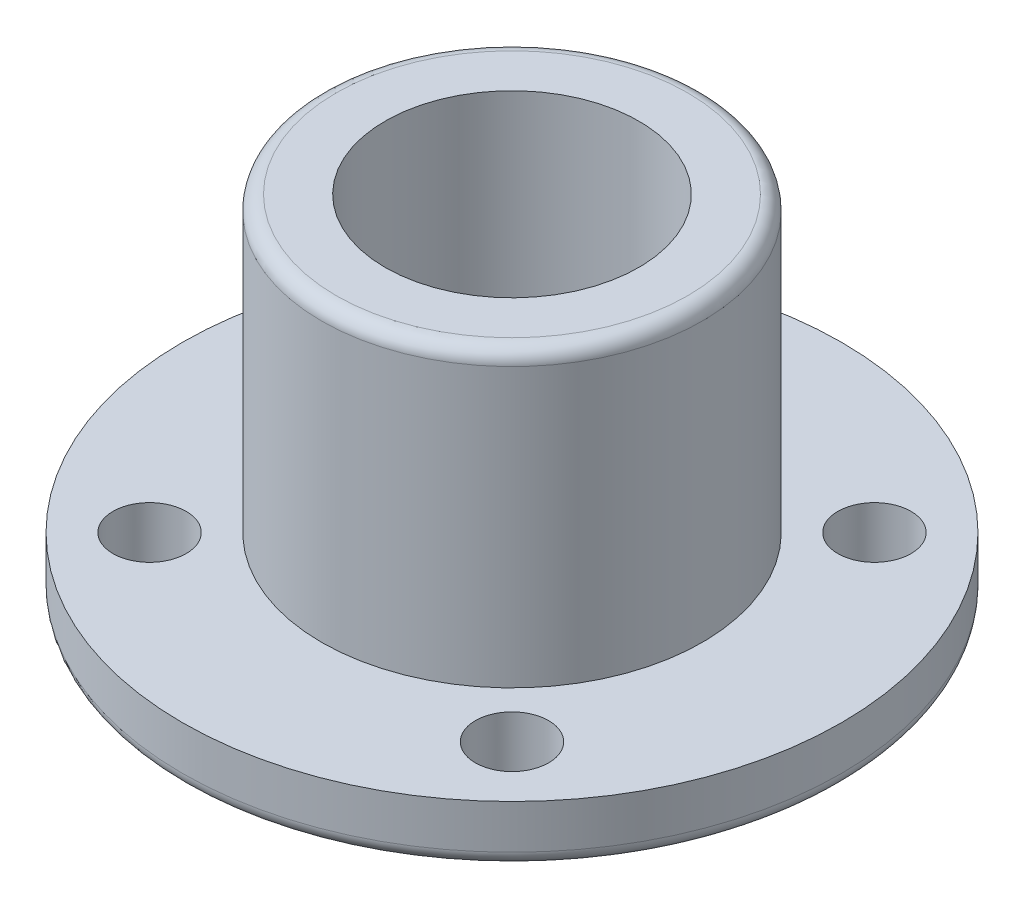
ISO-10303-21;
HEADER;
FILE_DESCRIPTION(('STEP AP214'),'2;1');
FILE_NAME('part.step','',(''),(''),'','','');
FILE_SCHEMA(('AUTOMOTIVE_DESIGN { 1 0 10303 214 1 1 1 1 }'));
ENDSEC;
DATA;
#1=APPLICATION_CONTEXT('core data for automotive mechanical design processes');
#2=APPLICATION_PROTOCOL_DEFINITION('international standard','automotive_design',2000,#1);
#3=PRODUCT_CONTEXT('',#1,'mechanical');
#4=PRODUCT('Part','Part','',(#3));
#5=PRODUCT_RELATED_PRODUCT_CATEGORY('part','',(#4));
#6=PRODUCT_DEFINITION_FORMATION('','',#4);
#7=PRODUCT_DEFINITION_CONTEXT('part definition',#1,'design');
#8=PRODUCT_DEFINITION('design','',#6,#7);
#9=PRODUCT_DEFINITION_SHAPE('','',#8);
#10=(LENGTH_UNIT() NAMED_UNIT(*) SI_UNIT(.MILLI.,.METRE.));
#11=(NAMED_UNIT(*) PLANE_ANGLE_UNIT() SI_UNIT($,.RADIAN.));
#12=(NAMED_UNIT(*) SI_UNIT($,.STERADIAN.) SOLID_ANGLE_UNIT());
#13=UNCERTAINTY_MEASURE_WITH_UNIT(LENGTH_MEASURE(1.E-05),#10,'distance_accuracy_value','');
#14=(GEOMETRIC_REPRESENTATION_CONTEXT(3) GLOBAL_UNCERTAINTY_ASSIGNED_CONTEXT((#13)) GLOBAL_UNIT_ASSIGNED_CONTEXT((#10,
#11,#12)) REPRESENTATION_CONTEXT('',''));
#15=CARTESIAN_POINT('',(0.,0.,0.));
#16=DIRECTION('',(0.,0.,1.));
#17=DIRECTION('',(1.,0.,0.));
#18=AXIS2_PLACEMENT_3D('',#15,#16,#17);
#19=CARTESIAN_POINT('',(0.,5.08,0.));
#20=DIRECTION('',(0.,-1.,0.));
#21=DIRECTION('',(0.,0.,-1.));
#22=AXIS2_PLACEMENT_3D('',#19,#20,#21);
#23=CYLINDRICAL_SURFACE('',#22,28.575);
#24=CARTESIAN_POINT('',(0.,1.27,0.));
#25=DIRECTION('',(0.,1.,0.));
#26=DIRECTION('',(0.,0.,1.));
#27=AXIS2_PLACEMENT_3D('',#24,#25,#26);
#28=CIRCLE('',#27,28.575);
#29=CARTESIAN_POINT('',(0.,1.27,28.575));
#30=VERTEX_POINT('',#29);
#31=EDGE_CURVE('E39',#30,#30,#28,.T.);
#32=ORIENTED_EDGE('',*,*,#31,.T.);
#33=EDGE_LOOP('',(#32));
#34=FACE_BOUND('',#33,.T.);
#35=CARTESIAN_POINT('',(0.,5.08,0.));
#36=DIRECTION('',(0.,1.,0.));
#37=DIRECTION('',(0.,0.,1.));
#38=AXIS2_PLACEMENT_3D('',#35,#36,#37);
#39=CIRCLE('',#38,28.575);
#40=CARTESIAN_POINT('',(0.,5.08,28.575));
#41=VERTEX_POINT('',#40);
#42=EDGE_CURVE('E70',#41,#41,#39,.T.);
#43=ORIENTED_EDGE('',*,*,#42,.F.);
#44=EDGE_LOOP('',(#43));
#45=FACE_BOUND('',#44,.T.);
#46=ADVANCED_FACE('F32',(#34,#45),#23,.T.);
#47=CARTESIAN_POINT('',(0.,5.08,0.));
#48=DIRECTION('',(0.,1.,0.));
#49=DIRECTION('',(0.,0.,1.));
#50=AXIS2_PLACEMENT_3D('',#47,#48,#49);
#51=PLANE('',#50);
#52=CARTESIAN_POINT('',(-15.7154482118708,5.08,-15.7154482118712));
#53=DIRECTION('',(0.,1.,0.));
#54=DIRECTION('',(0.,0.,1.));
#55=AXIS2_PLACEMENT_3D('',#52,#53,#54);
#56=CIRCLE('',#55,3.175);
#57=CARTESIAN_POINT('',(-15.7154482118708,5.08,-12.5404482118712));
#58=VERTEX_POINT('',#57);
#59=EDGE_CURVE('E58',#58,#58,#56,.T.);
#60=ORIENTED_EDGE('',*,*,#59,.F.);
#61=EDGE_LOOP('',(#60));
#62=FACE_BOUND('',#61,.T.);
#63=CARTESIAN_POINT('',(15.715448211871,5.08,-15.715448211871));
#64=DIRECTION('',(0.,1.,0.));
#65=DIRECTION('',(0.,0.,1.));
#66=AXIS2_PLACEMENT_3D('',#63,#64,#65);
#67=CIRCLE('',#66,3.175);
#68=CARTESIAN_POINT('',(15.715448211871,5.08,-12.540448211871));
#69=VERTEX_POINT('',#68);
#70=EDGE_CURVE('E62',#69,#69,#67,.T.);
#71=ORIENTED_EDGE('',*,*,#70,.F.);
#72=EDGE_LOOP('',(#71));
#73=FACE_BOUND('',#72,.T.);
#74=CARTESIAN_POINT('',(15.7154482118709,5.08,15.7154482118711));
#75=DIRECTION('',(0.,1.,0.));
#76=DIRECTION('',(0.,0.,1.));
#77=AXIS2_PLACEMENT_3D('',#74,#75,#76);
#78=CIRCLE('',#77,3.175);
#79=CARTESIAN_POINT('',(15.7154482118709,5.08,18.8904482118711));
#80=VERTEX_POINT('',#79);
#81=EDGE_CURVE('E66',#80,#80,#78,.T.);
#82=ORIENTED_EDGE('',*,*,#81,.F.);
#83=EDGE_LOOP('',(#82));
#84=FACE_BOUND('',#83,.T.);
#85=CARTESIAN_POINT('',(-15.7154482118712,5.08,15.7154482118709));
#86=DIRECTION('',(0.,1.,0.));
#87=DIRECTION('',(0.,0.,1.));
#88=AXIS2_PLACEMENT_3D('',#85,#86,#87);
#89=CIRCLE('',#88,3.175);
#90=CARTESIAN_POINT('',(-15.7154482118712,5.08,18.8904482118709));
#91=VERTEX_POINT('',#90);
#92=EDGE_CURVE('E73',#91,#91,#89,.T.);
#93=ORIENTED_EDGE('',*,*,#92,.F.);
#94=EDGE_LOOP('',(#93));
#95=FACE_BOUND('',#94,.T.);
#96=CARTESIAN_POINT('',(0.,5.08,0.));
#97=DIRECTION('',(0.,1.,0.));
#98=DIRECTION('',(0.,0.,1.));
#99=AXIS2_PLACEMENT_3D('',#96,#97,#98);
#100=CIRCLE('',#99,16.51);
#101=CARTESIAN_POINT('',(0.,5.08,16.51));
#102=VERTEX_POINT('',#101);
#103=EDGE_CURVE('E52',#102,#102,#100,.T.);
#104=ORIENTED_EDGE('',*,*,#103,.F.);
#105=EDGE_LOOP('',(#104));
#106=FACE_BOUND('',#105,.T.);
#107=ORIENTED_EDGE('',*,*,#42,.T.);
#108=EDGE_LOOP('',(#107));
#109=FACE_BOUND('',#108,.T.);
#110=ADVANCED_FACE('F107',(#62,#73,#84,#95,#106,#109),#51,.T.);
#111=CARTESIAN_POINT('',(0.,0.,0.));
#112=DIRECTION('',(0.,1.,0.));
#113=DIRECTION('',(0.,0.,1.));
#114=AXIS2_PLACEMENT_3D('',#111,#112,#113);
#115=PLANE('',#114);
#116=CARTESIAN_POINT('',(0.,0.,0.));
#117=DIRECTION('',(0.,1.,0.));
#118=DIRECTION('',(0.,0.,1.));
#119=AXIS2_PLACEMENT_3D('',#116,#117,#118);
#120=CIRCLE('',#119,27.305);
#121=CARTESIAN_POINT('',(0.,0.,27.305));
#122=VERTEX_POINT('',#121);
#123=EDGE_CURVE('E10',#122,#122,#120,.F.);
#124=ORIENTED_EDGE('',*,*,#123,.T.);
#125=EDGE_LOOP('',(#124));
#126=FACE_BOUND('',#125,.T.);
#127=CARTESIAN_POINT('',(0.,0.,0.));
#128=DIRECTION('',(0.,1.,0.));
#129=DIRECTION('',(0.,0.,1.));
#130=AXIS2_PLACEMENT_3D('',#127,#128,#129);
#131=CIRCLE('',#130,11.);
#132=CARTESIAN_POINT('',(0.,0.,11.));
#133=VERTEX_POINT('',#132);
#134=EDGE_CURVE('E57',#133,#133,#131,.T.);
#135=ORIENTED_EDGE('',*,*,#134,.T.);
#136=EDGE_LOOP('',(#135));
#137=FACE_BOUND('',#136,.T.);
#138=CARTESIAN_POINT('',(-15.7154482118708,0.,-15.7154482118712));
#139=DIRECTION('',(0.,-1.,0.));
#140=DIRECTION('',(0.,0.,-1.));
#141=AXIS2_PLACEMENT_3D('',#138,#139,#140);
#142=CIRCLE('',#141,3.175);
#143=CARTESIAN_POINT('',(-15.7154482118708,0.,-18.8904482118712));
#144=VERTEX_POINT('',#143);
#145=EDGE_CURVE('E56',#144,#144,#142,.T.);
#146=ORIENTED_EDGE('',*,*,#145,.F.);
#147=EDGE_LOOP('',(#146));
#148=FACE_BOUND('',#147,.T.);
#149=CARTESIAN_POINT('',(15.715448211871,0.,-15.715448211871));
#150=DIRECTION('',(0.,-1.,0.));
#151=DIRECTION('',(0.,0.,-1.));
#152=AXIS2_PLACEMENT_3D('',#149,#150,#151);
#153=CIRCLE('',#152,3.175);
#154=CARTESIAN_POINT('',(15.715448211871,0.,-18.890448211871));
#155=VERTEX_POINT('',#154);
#156=EDGE_CURVE('E61',#155,#155,#153,.T.);
#157=ORIENTED_EDGE('',*,*,#156,.F.);
#158=EDGE_LOOP('',(#157));
#159=FACE_BOUND('',#158,.T.);
#160=CARTESIAN_POINT('',(15.7154482118709,0.,15.7154482118711));
#161=DIRECTION('',(0.,-1.,0.));
#162=DIRECTION('',(0.,0.,-1.));
#163=AXIS2_PLACEMENT_3D('',#160,#161,#162);
#164=CIRCLE('',#163,3.175);
#165=CARTESIAN_POINT('',(15.7154482118709,0.,12.5404482118711));
#166=VERTEX_POINT('',#165);
#167=EDGE_CURVE('E65',#166,#166,#164,.T.);
#168=ORIENTED_EDGE('',*,*,#167,.F.);
#169=EDGE_LOOP('',(#168));
#170=FACE_BOUND('',#169,.T.);
#171=CARTESIAN_POINT('',(-15.7154482118712,0.,15.7154482118709));
#172=DIRECTION('',(0.,-1.,0.));
#173=DIRECTION('',(0.,0.,-1.));
#174=AXIS2_PLACEMENT_3D('',#171,#172,#173);
#175=CIRCLE('',#174,3.175);
#176=CARTESIAN_POINT('',(-15.7154482118712,0.,12.5404482118709));
#177=VERTEX_POINT('',#176);
#178=EDGE_CURVE('E69',#177,#177,#175,.T.);
#179=ORIENTED_EDGE('',*,*,#178,.F.);
#180=EDGE_LOOP('',(#179));
#181=FACE_BOUND('',#180,.T.);
#182=ADVANCED_FACE('F89',(#126,#137,#148,#159,#170,#181),#115,.F.);
#183=CARTESIAN_POINT('',(0.,30.48,0.));
#184=DIRECTION('',(0.,-1.,0.));
#185=DIRECTION('',(0.,0.,-1.));
#186=AXIS2_PLACEMENT_3D('',#183,#184,#185);
#187=CYLINDRICAL_SURFACE('',#186,16.51);
#188=CARTESIAN_POINT('',(0.,29.21,0.));
#189=DIRECTION('',(0.,1.,0.));
#190=DIRECTION('',(0.,0.,1.));
#191=AXIS2_PLACEMENT_3D('',#188,#189,#190);
#192=CIRCLE('',#191,16.51);
#193=CARTESIAN_POINT('',(0.,29.21,16.51));
#194=VERTEX_POINT('',#193);
#195=EDGE_CURVE('E43',#194,#194,#192,.F.);
#196=ORIENTED_EDGE('',*,*,#195,.T.);
#197=EDGE_LOOP('',(#196));
#198=FACE_BOUND('',#197,.T.);
#199=ORIENTED_EDGE('',*,*,#103,.T.);
#200=EDGE_LOOP('',(#199));
#201=FACE_BOUND('',#200,.T.);
#202=ADVANCED_FACE('F117',(#198,#201),#187,.T.);
#203=CARTESIAN_POINT('',(0.,30.48,0.));
#204=DIRECTION('',(0.,1.,0.));
#205=DIRECTION('',(0.,0.,1.));
#206=AXIS2_PLACEMENT_3D('',#203,#204,#205);
#207=PLANE('',#206);
#208=CARTESIAN_POINT('',(0.,30.48,0.));
#209=DIRECTION('',(0.,1.,0.));
#210=DIRECTION('',(0.,0.,1.));
#211=AXIS2_PLACEMENT_3D('',#208,#209,#210);
#212=CIRCLE('',#211,15.24);
#213=CARTESIAN_POINT('',(0.,30.48,15.24));
#214=VERTEX_POINT('',#213);
#215=EDGE_CURVE('E47',#214,#214,#212,.T.);
#216=ORIENTED_EDGE('',*,*,#215,.T.);
#217=EDGE_LOOP('',(#216));
#218=FACE_BOUND('',#217,.T.);
#219=CARTESIAN_POINT('',(0.,30.48,0.));
#220=DIRECTION('',(0.,1.,0.));
#221=DIRECTION('',(0.,0.,1.));
#222=AXIS2_PLACEMENT_3D('',#219,#220,#221);
#223=CIRCLE('',#222,11.);
#224=CARTESIAN_POINT('',(0.,30.48,11.));
#225=VERTEX_POINT('',#224);
#226=EDGE_CURVE('E53',#225,#225,#223,.T.);
#227=ORIENTED_EDGE('',*,*,#226,.F.);
#228=EDGE_LOOP('',(#227));
#229=FACE_BOUND('',#228,.T.);
#230=ADVANCED_FACE('F121',(#218,#229),#207,.T.);
#231=CARTESIAN_POINT('',(-15.7154482118712,0.,15.7154482118709));
#232=DIRECTION('',(0.,-1.,0.));
#233=DIRECTION('',(0.,0.,-1.));
#234=AXIS2_PLACEMENT_3D('',#231,#232,#233);
#235=CYLINDRICAL_SURFACE('',#234,3.175);
#236=ORIENTED_EDGE('',*,*,#92,.T.);
#237=EDGE_LOOP('',(#236));
#238=FACE_BOUND('',#237,.T.);
#239=ORIENTED_EDGE('',*,*,#178,.T.);
#240=EDGE_LOOP('',(#239));
#241=FACE_BOUND('',#240,.T.);
#242=ADVANCED_FACE('F125',(#238,#241),#235,.F.);
#243=CARTESIAN_POINT('',(15.7154482118709,0.,15.7154482118711));
#244=DIRECTION('',(0.,-1.,0.));
#245=DIRECTION('',(0.,0.,-1.));
#246=AXIS2_PLACEMENT_3D('',#243,#244,#245);
#247=CYLINDRICAL_SURFACE('',#246,3.175);
#248=ORIENTED_EDGE('',*,*,#81,.T.);
#249=EDGE_LOOP('',(#248));
#250=FACE_BOUND('',#249,.T.);
#251=ORIENTED_EDGE('',*,*,#167,.T.);
#252=EDGE_LOOP('',(#251));
#253=FACE_BOUND('',#252,.T.);
#254=ADVANCED_FACE('F129',(#250,#253),#247,.F.);
#255=CARTESIAN_POINT('',(15.715448211871,0.,-15.715448211871));
#256=DIRECTION('',(0.,-1.,0.));
#257=DIRECTION('',(0.,0.,-1.));
#258=AXIS2_PLACEMENT_3D('',#255,#256,#257);
#259=CYLINDRICAL_SURFACE('',#258,3.175);
#260=ORIENTED_EDGE('',*,*,#70,.T.);
#261=EDGE_LOOP('',(#260));
#262=FACE_BOUND('',#261,.T.);
#263=ORIENTED_EDGE('',*,*,#156,.T.);
#264=EDGE_LOOP('',(#263));
#265=FACE_BOUND('',#264,.T.);
#266=ADVANCED_FACE('F103',(#262,#265),#259,.F.);
#267=CARTESIAN_POINT('',(-15.7154482118708,0.,-15.7154482118712));
#268=DIRECTION('',(0.,-1.,0.));
#269=DIRECTION('',(0.,0.,-1.));
#270=AXIS2_PLACEMENT_3D('',#267,#268,#269);
#271=CYLINDRICAL_SURFACE('',#270,3.175);
#272=ORIENTED_EDGE('',*,*,#59,.T.);
#273=EDGE_LOOP('',(#272));
#274=FACE_BOUND('',#273,.T.);
#275=ORIENTED_EDGE('',*,*,#145,.T.);
#276=EDGE_LOOP('',(#275));
#277=FACE_BOUND('',#276,.T.);
#278=ADVANCED_FACE('F95',(#274,#277),#271,.F.);
#279=CARTESIAN_POINT('',(0.,0.,0.));
#280=DIRECTION('',(0.,1.,0.));
#281=DIRECTION('',(0.,0.,1.));
#282=AXIS2_PLACEMENT_3D('',#279,#280,#281);
#283=CYLINDRICAL_SURFACE('',#282,11.);
#284=ORIENTED_EDGE('',*,*,#226,.T.);
#285=EDGE_LOOP('',(#284));
#286=FACE_BOUND('',#285,.T.);
#287=ORIENTED_EDGE('',*,*,#134,.F.);
#288=EDGE_LOOP('',(#287));
#289=FACE_BOUND('',#288,.T.);
#290=ADVANCED_FACE('F92',(#286,#289),#283,.F.);
#291=CARTESIAN_POINT('',(0.,29.21,0.));
#292=DIRECTION('',(0.,1.,0.));
#293=DIRECTION('',(0.,0.,1.));
#294=AXIS2_PLACEMENT_3D('',#291,#292,#293);
#295=TOROIDAL_SURFACE('',#294,15.24,1.27);
#296=ORIENTED_EDGE('',*,*,#195,.F.);
#297=EDGE_LOOP('',(#296));
#298=FACE_BOUND('',#297,.T.);
#299=ORIENTED_EDGE('',*,*,#215,.F.);
#300=EDGE_LOOP('',(#299));
#301=FACE_BOUND('',#300,.T.);
#302=ADVANCED_FACE('F94',(#298,#301),#295,.T.);
#303=CARTESIAN_POINT('',(0.,1.27,0.));
#304=DIRECTION('',(0.,1.,0.));
#305=DIRECTION('',(0.,0.,1.));
#306=AXIS2_PLACEMENT_3D('',#303,#304,#305);
#307=TOROIDAL_SURFACE('',#306,27.305,1.27);
#308=ORIENTED_EDGE('',*,*,#123,.F.);
#309=EDGE_LOOP('',(#308));
#310=FACE_BOUND('',#309,.T.);
#311=ORIENTED_EDGE('',*,*,#31,.F.);
#312=EDGE_LOOP('',(#311));
#313=FACE_BOUND('',#312,.T.);
#314=ADVANCED_FACE('F34',(#310,#313),#307,.T.);
#315=CLOSED_SHELL('',(#46,#110,#182,#202,#230,#242,#254,#266,#278,#290,#302,#314));
#316=MANIFOLD_SOLID_BREP('B2',#315);
#317=ADVANCED_BREP_SHAPE_REPRESENTATION('',(#18,#316),#14);
#318=SHAPE_DEFINITION_REPRESENTATION(#9,#317);
ENDSEC;
END-ISO-10303-21;
